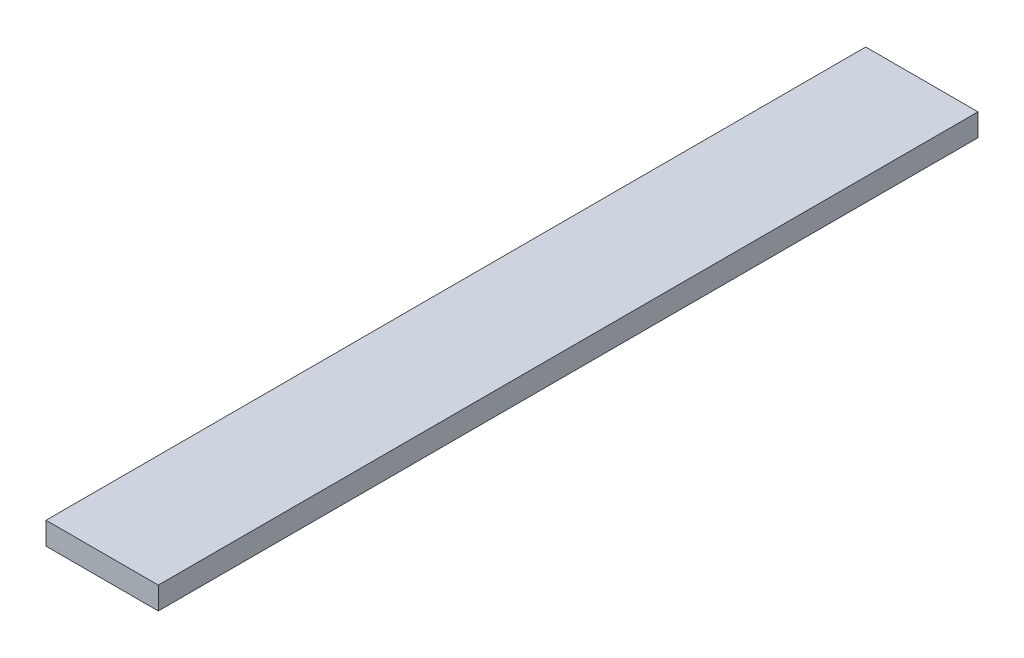
ISO-10303-21;
HEADER;
FILE_DESCRIPTION(('STEP AP214'),'2;1');
FILE_NAME('part.step','',(''),(''),'','','');
FILE_SCHEMA(('AUTOMOTIVE_DESIGN { 1 0 10303 214 1 1 1 1 }'));
ENDSEC;
DATA;
#1=APPLICATION_CONTEXT('core data for automotive mechanical design processes');
#2=APPLICATION_PROTOCOL_DEFINITION('international standard','automotive_design',2000,#1);
#3=PRODUCT_CONTEXT('',#1,'mechanical');
#4=PRODUCT('Part','Part','',(#3));
#5=PRODUCT_RELATED_PRODUCT_CATEGORY('part','',(#4));
#6=PRODUCT_DEFINITION_FORMATION('','',#4);
#7=PRODUCT_DEFINITION_CONTEXT('part definition',#1,'design');
#8=PRODUCT_DEFINITION('design','',#6,#7);
#9=PRODUCT_DEFINITION_SHAPE('','',#8);
#10=(LENGTH_UNIT() NAMED_UNIT(*) SI_UNIT(.MILLI.,.METRE.));
#11=(NAMED_UNIT(*) PLANE_ANGLE_UNIT() SI_UNIT($,.RADIAN.));
#12=(NAMED_UNIT(*) SI_UNIT($,.STERADIAN.) SOLID_ANGLE_UNIT());
#13=UNCERTAINTY_MEASURE_WITH_UNIT(LENGTH_MEASURE(1.E-05),#10,'distance_accuracy_value','');
#14=(GEOMETRIC_REPRESENTATION_CONTEXT(3) GLOBAL_UNCERTAINTY_ASSIGNED_CONTEXT((#13)) GLOBAL_UNIT_ASSIGNED_CONTEXT((#10,
#11,#12)) REPRESENTATION_CONTEXT('',''));
#15=CARTESIAN_POINT('',(0.,0.,0.));
#16=DIRECTION('',(0.,0.,1.));
#17=DIRECTION('',(1.,0.,0.));
#18=AXIS2_PLACEMENT_3D('',#15,#16,#17);
#19=CARTESIAN_POINT('',(2.5,1.,-18.25));
#20=DIRECTION('',(-1.,0.,0.));
#21=DIRECTION('',(0.,0.,1.));
#22=AXIS2_PLACEMENT_3D('',#19,#20,#21);
#23=PLANE('',#22);
#24=DIRECTION('',(0.,0.,-1.));
#25=VECTOR('',#24,1.);
#26=CARTESIAN_POINT('',(2.5,0.,-18.25));
#27=LINE('',#26,#25);
#28=CARTESIAN_POINT('',(2.5,0.,18.25));
#29=VERTEX_POINT('',#28);
#30=CARTESIAN_POINT('',(2.5,0.,-18.25));
#31=VERTEX_POINT('',#30);
#32=EDGE_CURVE('E95',#29,#31,#27,.T.);
#33=ORIENTED_EDGE('',*,*,#32,.T.);
#34=DIRECTION('',(0.,-1.,0.));
#35=VECTOR('',#34,1.);
#36=CARTESIAN_POINT('',(2.5,1.,-18.25));
#37=LINE('',#36,#35);
#38=CARTESIAN_POINT('',(2.5,1.,-18.25));
#39=VERTEX_POINT('',#38);
#40=EDGE_CURVE('E11',#39,#31,#37,.T.);
#41=ORIENTED_EDGE('',*,*,#40,.F.);
#42=DIRECTION('',(0.,0.,-1.));
#43=VECTOR('',#42,1.);
#44=CARTESIAN_POINT('',(2.5,1.,-18.25));
#45=LINE('',#44,#43);
#46=CARTESIAN_POINT('',(2.5,1.,18.25));
#47=VERTEX_POINT('',#46);
#48=EDGE_CURVE('E83',#47,#39,#45,.T.);
#49=ORIENTED_EDGE('',*,*,#48,.F.);
#50=DIRECTION('',(0.,-1.,0.));
#51=VECTOR('',#50,1.);
#52=CARTESIAN_POINT('',(2.5,1.,18.25));
#53=LINE('',#52,#51);
#54=EDGE_CURVE('E91',#47,#29,#53,.T.);
#55=ORIENTED_EDGE('',*,*,#54,.T.);
#56=EDGE_LOOP('',(#33,#41,#49,#55));
#57=FACE_BOUND('',#56,.T.);
#58=ADVANCED_FACE('F32',(#57),#23,.F.);
#59=CARTESIAN_POINT('',(-2.5,1.,-18.25));
#60=DIRECTION('',(0.,0.,1.));
#61=DIRECTION('',(1.,0.,0.));
#62=AXIS2_PLACEMENT_3D('',#59,#60,#61);
#63=PLANE('',#62);
#64=DIRECTION('',(-1.,0.,0.));
#65=VECTOR('',#64,1.);
#66=CARTESIAN_POINT('',(-2.5,0.,-18.25));
#67=LINE('',#66,#65);
#68=CARTESIAN_POINT('',(-2.5,0.,-18.25));
#69=VERTEX_POINT('',#68);
#70=EDGE_CURVE('E87',#31,#69,#67,.T.);
#71=ORIENTED_EDGE('',*,*,#70,.T.);
#72=DIRECTION('',(0.,-1.,0.));
#73=VECTOR('',#72,1.);
#74=CARTESIAN_POINT('',(-2.5,1.,-18.25));
#75=LINE('',#74,#73);
#76=CARTESIAN_POINT('',(-2.5,1.,-18.25));
#77=VERTEX_POINT('',#76);
#78=EDGE_CURVE('E40',#77,#69,#75,.T.);
#79=ORIENTED_EDGE('',*,*,#78,.F.);
#80=DIRECTION('',(-1.,0.,0.));
#81=VECTOR('',#80,1.);
#82=CARTESIAN_POINT('',(-2.5,1.,-18.25));
#83=LINE('',#82,#81);
#84=EDGE_CURVE('E78',#39,#77,#83,.T.);
#85=ORIENTED_EDGE('',*,*,#84,.F.);
#86=ORIENTED_EDGE('',*,*,#40,.T.);
#87=EDGE_LOOP('',(#71,#79,#85,#86));
#88=FACE_BOUND('',#87,.T.);
#89=ADVANCED_FACE('F86',(#88),#63,.F.);
#90=CARTESIAN_POINT('',(-2.5,1.,-18.25));
#91=DIRECTION('',(1.,0.,0.));
#92=DIRECTION('',(0.,0.,-1.));
#93=AXIS2_PLACEMENT_3D('',#90,#91,#92);
#94=PLANE('',#93);
#95=DIRECTION('',(0.,0.,1.));
#96=VECTOR('',#95,1.);
#97=CARTESIAN_POINT('',(-2.5,0.,-18.25));
#98=LINE('',#97,#96);
#99=CARTESIAN_POINT('',(-2.5,0.,18.25));
#100=VERTEX_POINT('',#99);
#101=EDGE_CURVE('E65',#69,#100,#98,.T.);
#102=ORIENTED_EDGE('',*,*,#101,.T.);
#103=DIRECTION('',(0.,-1.,0.));
#104=VECTOR('',#103,1.);
#105=CARTESIAN_POINT('',(-2.5,1.,18.25));
#106=LINE('',#105,#104);
#107=CARTESIAN_POINT('',(-2.5,1.,18.25));
#108=VERTEX_POINT('',#107);
#109=EDGE_CURVE('E88',#108,#100,#106,.T.);
#110=ORIENTED_EDGE('',*,*,#109,.F.);
#111=DIRECTION('',(0.,0.,1.));
#112=VECTOR('',#111,1.);
#113=CARTESIAN_POINT('',(-2.5,1.,-18.25));
#114=LINE('',#113,#112);
#115=EDGE_CURVE('E81',#77,#108,#114,.T.);
#116=ORIENTED_EDGE('',*,*,#115,.F.);
#117=ORIENTED_EDGE('',*,*,#78,.T.);
#118=EDGE_LOOP('',(#102,#110,#116,#117));
#119=FACE_BOUND('',#118,.T.);
#120=ADVANCED_FACE('F89',(#119),#94,.F.);
#121=CARTESIAN_POINT('',(-2.5,1.,18.25));
#122=DIRECTION('',(0.,0.,-1.));
#123=DIRECTION('',(-1.,0.,0.));
#124=AXIS2_PLACEMENT_3D('',#121,#122,#123);
#125=PLANE('',#124);
#126=DIRECTION('',(1.,0.,0.));
#127=VECTOR('',#126,1.);
#128=CARTESIAN_POINT('',(-2.5,0.,18.25));
#129=LINE('',#128,#127);
#130=EDGE_CURVE('E71',#100,#29,#129,.T.);
#131=ORIENTED_EDGE('',*,*,#130,.T.);
#132=ORIENTED_EDGE('',*,*,#54,.F.);
#133=DIRECTION('',(1.,0.,0.));
#134=VECTOR('',#133,1.);
#135=CARTESIAN_POINT('',(-2.5,1.,18.25));
#136=LINE('',#135,#134);
#137=EDGE_CURVE('E48',#108,#47,#136,.T.);
#138=ORIENTED_EDGE('',*,*,#137,.F.);
#139=ORIENTED_EDGE('',*,*,#109,.T.);
#140=EDGE_LOOP('',(#131,#132,#138,#139));
#141=FACE_BOUND('',#140,.T.);
#142=ADVANCED_FACE('F102',(#141),#125,.F.);
#143=CARTESIAN_POINT('',(0.,1.,0.));
#144=DIRECTION('',(0.,1.,0.));
#145=DIRECTION('',(0.,0.,1.));
#146=AXIS2_PLACEMENT_3D('',#143,#144,#145);
#147=PLANE('',#146);
#148=ORIENTED_EDGE('',*,*,#48,.T.);
#149=ORIENTED_EDGE('',*,*,#84,.T.);
#150=ORIENTED_EDGE('',*,*,#115,.T.);
#151=ORIENTED_EDGE('',*,*,#137,.T.);
#152=EDGE_LOOP('',(#148,#149,#150,#151));
#153=FACE_BOUND('',#152,.T.);
#154=ADVANCED_FACE('F79',(#153),#147,.T.);
#155=CARTESIAN_POINT('',(0.,0.,0.));
#156=DIRECTION('',(0.,1.,0.));
#157=DIRECTION('',(0.,0.,1.));
#158=AXIS2_PLACEMENT_3D('',#155,#156,#157);
#159=PLANE('',#158);
#160=ORIENTED_EDGE('',*,*,#32,.F.);
#161=ORIENTED_EDGE('',*,*,#130,.F.);
#162=ORIENTED_EDGE('',*,*,#101,.F.);
#163=ORIENTED_EDGE('',*,*,#70,.F.);
#164=EDGE_LOOP('',(#160,#161,#162,#163));
#165=FACE_BOUND('',#164,.T.);
#166=ADVANCED_FACE('F105',(#165),#159,.F.);
#167=CLOSED_SHELL('',(#58,#89,#120,#142,#154,#166));
#168=MANIFOLD_SOLID_BREP('B2',#167);
#169=ADVANCED_BREP_SHAPE_REPRESENTATION('',(#18,#168),#14);
#170=SHAPE_DEFINITION_REPRESENTATION(#9,#169);
ENDSEC;
END-ISO-10303-21;
